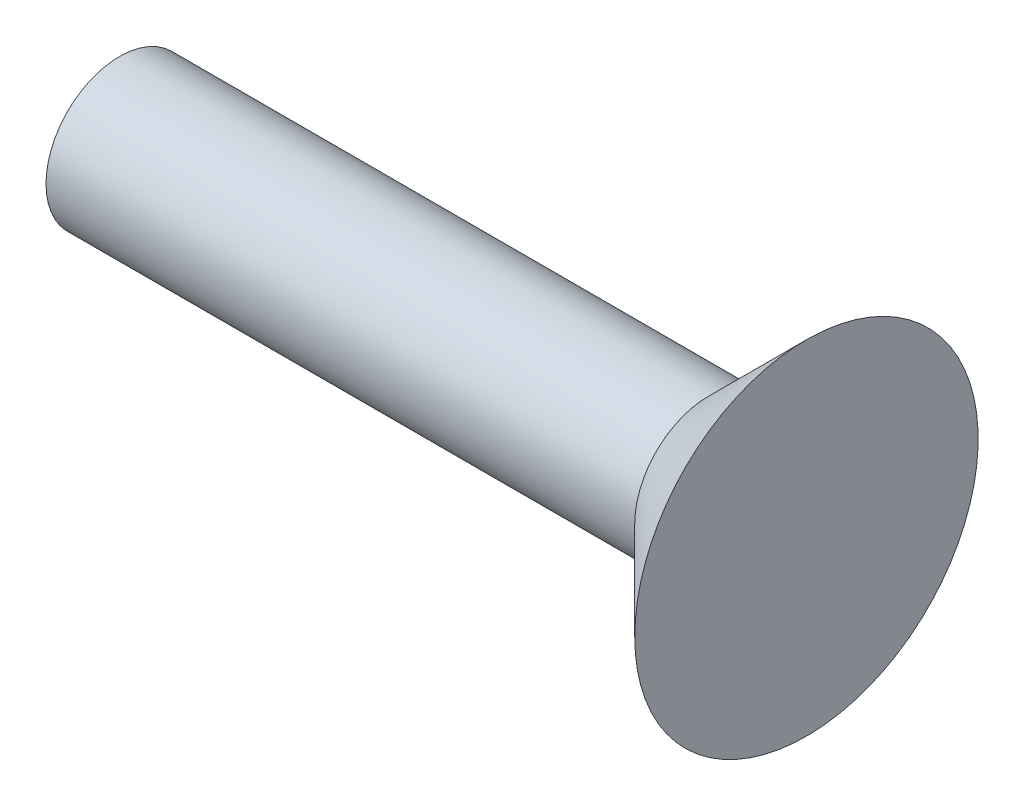
ISO-10303-21;
HEADER;
FILE_DESCRIPTION(('STEP AP214'),'2;1');
FILE_NAME('part.step','',(''),(''),'','','');
FILE_SCHEMA(('AUTOMOTIVE_DESIGN { 1 0 10303 214 1 1 1 1 }'));
ENDSEC;
DATA;
#1=APPLICATION_CONTEXT('core data for automotive mechanical design processes');
#2=APPLICATION_PROTOCOL_DEFINITION('international standard','automotive_design',2000,#1);
#3=PRODUCT_CONTEXT('',#1,'mechanical');
#4=PRODUCT('Part','Part','',(#3));
#5=PRODUCT_RELATED_PRODUCT_CATEGORY('part','',(#4));
#6=PRODUCT_DEFINITION_FORMATION('','',#4);
#7=PRODUCT_DEFINITION_CONTEXT('part definition',#1,'design');
#8=PRODUCT_DEFINITION('design','',#6,#7);
#9=PRODUCT_DEFINITION_SHAPE('','',#8);
#10=(LENGTH_UNIT() NAMED_UNIT(*) SI_UNIT(.MILLI.,.METRE.));
#11=(NAMED_UNIT(*) PLANE_ANGLE_UNIT() SI_UNIT($,.RADIAN.));
#12=(NAMED_UNIT(*) SI_UNIT($,.STERADIAN.) SOLID_ANGLE_UNIT());
#13=UNCERTAINTY_MEASURE_WITH_UNIT(LENGTH_MEASURE(1.E-05),#10,'distance_accuracy_value','');
#14=(GEOMETRIC_REPRESENTATION_CONTEXT(3) GLOBAL_UNCERTAINTY_ASSIGNED_CONTEXT((#13)) GLOBAL_UNIT_ASSIGNED_CONTEXT((#10,
#11,#12)) REPRESENTATION_CONTEXT('',''));
#15=CARTESIAN_POINT('',(0.,0.,0.));
#16=DIRECTION('',(0.,0.,1.));
#17=DIRECTION('',(1.,0.,0.));
#18=AXIS2_PLACEMENT_3D('',#15,#16,#17);
#19=CARTESIAN_POINT('',(-84.0032333856533,19.234385214472,0.));
#20=DIRECTION('',(1.,0.,0.));
#21=DIRECTION('',(0.,0.,-1.));
#22=AXIS2_PLACEMENT_3D('',#19,#20,#21);
#23=PLANE('',#22);
#24=CARTESIAN_POINT('',(-84.0032333856533,17.734385214472,0.));
#25=DIRECTION('',(-1.,0.,0.));
#26=DIRECTION('',(0.,0.,1.));
#27=AXIS2_PLACEMENT_3D('',#24,#25,#26);
#28=CIRCLE('',#27,1.5);
#29=CARTESIAN_POINT('',(-84.0032333856533,17.734385214472,1.5));
#30=VERTEX_POINT('',#29);
#31=EDGE_CURVE('E10',#30,#30,#28,.T.);
#32=ORIENTED_EDGE('',*,*,#31,.T.);
#33=EDGE_LOOP('',(#32));
#34=FACE_BOUND('',#33,.T.);
#35=ADVANCED_FACE('F35',(#34),#23,.F.);
#36=CARTESIAN_POINT('',(-84.0032333856533,17.734385214472,0.));
#37=DIRECTION('',(-1.,0.,0.));
#38=DIRECTION('',(0.,0.,1.));
#39=AXIS2_PLACEMENT_3D('',#36,#37,#38);
#40=CYLINDRICAL_SURFACE('',#39,1.5);
#41=ORIENTED_EDGE('',*,*,#31,.F.);
#42=EDGE_LOOP('',(#41));
#43=FACE_BOUND('',#42,.T.);
#44=CARTESIAN_POINT('',(-72.0032333856533,17.734385214472,0.));
#45=DIRECTION('',(-1.,0.,0.));
#46=DIRECTION('',(0.,0.,1.));
#47=AXIS2_PLACEMENT_3D('',#44,#45,#46);
#48=CIRCLE('',#47,1.5);
#49=CARTESIAN_POINT('',(-72.0032333856533,17.734385214472,1.5));
#50=VERTEX_POINT('',#49);
#51=EDGE_CURVE('E41',#50,#50,#48,.T.);
#52=ORIENTED_EDGE('',*,*,#51,.T.);
#53=EDGE_LOOP('',(#52));
#54=FACE_BOUND('',#53,.T.);
#55=ADVANCED_FACE('F60',(#43,#54),#40,.T.);
#56=CARTESIAN_POINT('',(-70.0032333856533,17.734385214472,0.));
#57=DIRECTION('',(1.,0.,0.));
#58=DIRECTION('',(0.,0.,-1.));
#59=AXIS2_PLACEMENT_3D('',#56,#57,#58);
#60=CONICAL_SURFACE('',#59,3.5,0.785398163397447);
#61=ORIENTED_EDGE('',*,*,#51,.F.);
#62=EDGE_LOOP('',(#61));
#63=FACE_BOUND('',#62,.T.);
#64=CARTESIAN_POINT('',(-70.0032333856533,17.734385214472,0.));
#65=DIRECTION('',(-1.,0.,0.));
#66=DIRECTION('',(0.,0.,1.));
#67=AXIS2_PLACEMENT_3D('',#64,#65,#66);
#68=CIRCLE('',#67,3.5);
#69=CARTESIAN_POINT('',(-70.0032333856533,17.734385214472,3.5));
#70=VERTEX_POINT('',#69);
#71=EDGE_CURVE('E45',#70,#70,#68,.T.);
#72=ORIENTED_EDGE('',*,*,#71,.T.);
#73=EDGE_LOOP('',(#72));
#74=FACE_BOUND('',#73,.T.);
#75=ADVANCED_FACE('F52',(#63,#74),#60,.T.);
#76=CARTESIAN_POINT('',(-70.0032333856533,17.734385214472,0.));
#77=DIRECTION('',(-1.,0.,0.));
#78=DIRECTION('',(0.,0.,1.));
#79=AXIS2_PLACEMENT_3D('',#76,#77,#78);
#80=PLANE('',#79);
#81=ORIENTED_EDGE('',*,*,#71,.F.);
#82=EDGE_LOOP('',(#81));
#83=FACE_BOUND('',#82,.T.);
#84=ADVANCED_FACE('F54',(#83),#80,.F.);
#85=CLOSED_SHELL('',(#35,#55,#75,#84));
#86=MANIFOLD_SOLID_BREP('B2',#85);
#87=ADVANCED_BREP_SHAPE_REPRESENTATION('',(#18,#86),#14);
#88=SHAPE_DEFINITION_REPRESENTATION(#9,#87);
ENDSEC;
END-ISO-10303-21;
